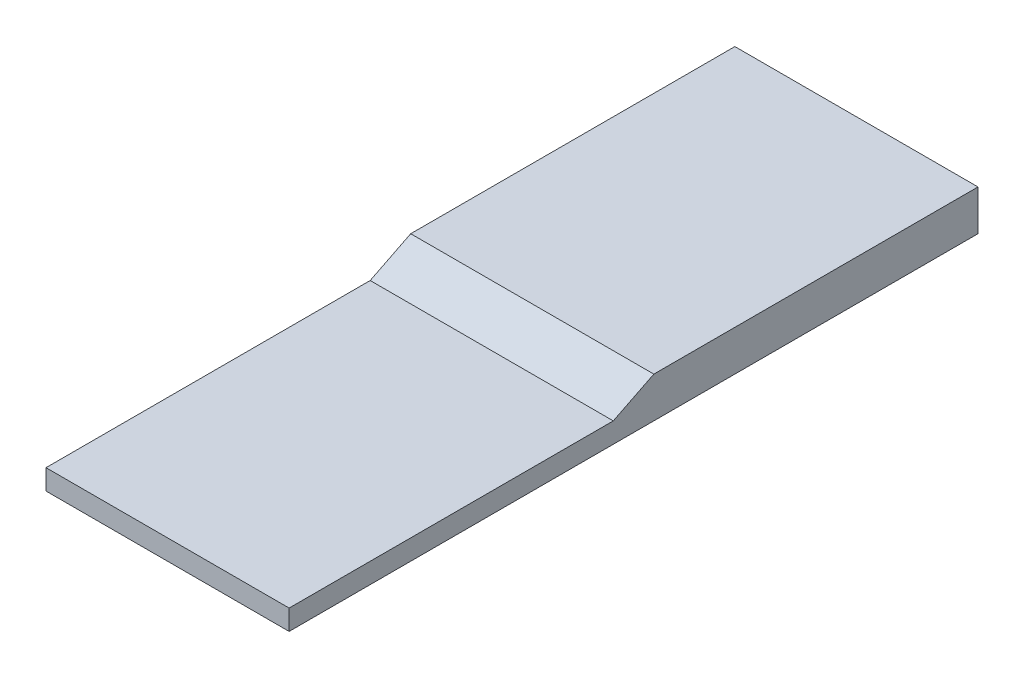
ISO-10303-21;
HEADER;
FILE_DESCRIPTION(('STEP AP214'),'2;1');
FILE_NAME('part.step','',(''),(''),'','','');
FILE_SCHEMA(('AUTOMOTIVE_DESIGN { 1 0 10303 214 1 1 1 1 }'));
ENDSEC;
DATA;
#1=APPLICATION_CONTEXT('core data for automotive mechanical design processes');
#2=APPLICATION_PROTOCOL_DEFINITION('international standard','automotive_design',2000,#1);
#3=PRODUCT_CONTEXT('',#1,'mechanical');
#4=PRODUCT('Part','Part','',(#3));
#5=PRODUCT_RELATED_PRODUCT_CATEGORY('part','',(#4));
#6=PRODUCT_DEFINITION_FORMATION('','',#4);
#7=PRODUCT_DEFINITION_CONTEXT('part definition',#1,'design');
#8=PRODUCT_DEFINITION('design','',#6,#7);
#9=PRODUCT_DEFINITION_SHAPE('','',#8);
#10=(LENGTH_UNIT() NAMED_UNIT(*) SI_UNIT(.MILLI.,.METRE.));
#11=(NAMED_UNIT(*) PLANE_ANGLE_UNIT() SI_UNIT($,.RADIAN.));
#12=(NAMED_UNIT(*) SI_UNIT($,.STERADIAN.) SOLID_ANGLE_UNIT());
#13=UNCERTAINTY_MEASURE_WITH_UNIT(LENGTH_MEASURE(1.E-05),#10,'distance_accuracy_value','');
#14=(GEOMETRIC_REPRESENTATION_CONTEXT(3) GLOBAL_UNCERTAINTY_ASSIGNED_CONTEXT((#13)) GLOBAL_UNIT_ASSIGNED_CONTEXT((#10,
#11,#12)) REPRESENTATION_CONTEXT('',''));
#15=CARTESIAN_POINT('',(0.,0.,0.));
#16=DIRECTION('',(0.,0.,1.));
#17=DIRECTION('',(1.,0.,0.));
#18=AXIS2_PLACEMENT_3D('',#15,#16,#17);
#19=CARTESIAN_POINT('',(304.8,-25.4,406.4));
#20=DIRECTION('',(0.,0.,-1.));
#21=DIRECTION('',(-1.,0.,0.));
#22=AXIS2_PLACEMENT_3D('',#19,#20,#21);
#23=PLANE('',#22);
#24=DIRECTION('',(0.,-1.,0.));
#25=VECTOR('',#24,1.);
#26=CARTESIAN_POINT('',(0.,-25.4,406.4));
#27=LINE('',#26,#25);
#28=CARTESIAN_POINT('',(0.,0.,406.4));
#29=VERTEX_POINT('',#28);
#30=CARTESIAN_POINT('',(0.,-25.4,406.4));
#31=VERTEX_POINT('',#30);
#32=EDGE_CURVE('E117',#29,#31,#27,.T.);
#33=ORIENTED_EDGE('',*,*,#32,.T.);
#34=DIRECTION('',(-1.,0.,0.));
#35=VECTOR('',#34,1.);
#36=CARTESIAN_POINT('',(304.8,-25.4,406.4));
#37=LINE('',#36,#35);
#38=CARTESIAN_POINT('',(304.8,-25.4,406.4));
#39=VERTEX_POINT('',#38);
#40=EDGE_CURVE('E11',#39,#31,#37,.T.);
#41=ORIENTED_EDGE('',*,*,#40,.F.);
#42=DIRECTION('',(0.,-1.,0.));
#43=VECTOR('',#42,1.);
#44=CARTESIAN_POINT('',(304.8,-25.4,406.4));
#45=LINE('',#44,#43);
#46=CARTESIAN_POINT('',(304.8,0.,406.4));
#47=VERTEX_POINT('',#46);
#48=EDGE_CURVE('E127',#47,#39,#45,.T.);
#49=ORIENTED_EDGE('',*,*,#48,.F.);
#50=DIRECTION('',(-1.,0.,0.));
#51=VECTOR('',#50,1.);
#52=CARTESIAN_POINT('',(304.8,0.,406.4));
#53=LINE('',#52,#51);
#54=EDGE_CURVE('E113',#47,#29,#53,.T.);
#55=ORIENTED_EDGE('',*,*,#54,.T.);
#56=EDGE_LOOP('',(#33,#41,#49,#55));
#57=FACE_BOUND('',#56,.T.);
#58=ADVANCED_FACE('F33',(#57),#23,.F.);
#59=CARTESIAN_POINT('',(304.8,-25.3999999999999,-457.2));
#60=DIRECTION('',(0.,1.,0.));
#61=DIRECTION('',(0.,0.,1.));
#62=AXIS2_PLACEMENT_3D('',#59,#60,#61);
#63=PLANE('',#62);
#64=DIRECTION('',(0.,0.,-1.));
#65=VECTOR('',#64,1.);
#66=CARTESIAN_POINT('',(0.,-25.3999999999999,-457.2));
#67=LINE('',#66,#65);
#68=CARTESIAN_POINT('',(0.,-25.3999999999999,-457.2));
#69=VERTEX_POINT('',#68);
#70=EDGE_CURVE('E120',#31,#69,#67,.T.);
#71=ORIENTED_EDGE('',*,*,#70,.T.);
#72=DIRECTION('',(-1.,0.,0.));
#73=VECTOR('',#72,1.);
#74=CARTESIAN_POINT('',(304.8,-25.3999999999999,-457.2));
#75=LINE('',#74,#73);
#76=CARTESIAN_POINT('',(304.8,-25.3999999999999,-457.2));
#77=VERTEX_POINT('',#76);
#78=EDGE_CURVE('E41',#77,#69,#75,.T.);
#79=ORIENTED_EDGE('',*,*,#78,.F.);
#80=DIRECTION('',(0.,0.,-1.));
#81=VECTOR('',#80,1.);
#82=CARTESIAN_POINT('',(304.8,-25.3999999999999,-457.2));
#83=LINE('',#82,#81);
#84=EDGE_CURVE('E86',#39,#77,#83,.T.);
#85=ORIENTED_EDGE('',*,*,#84,.F.);
#86=ORIENTED_EDGE('',*,*,#40,.T.);
#87=EDGE_LOOP('',(#71,#79,#85,#86));
#88=FACE_BOUND('',#87,.T.);
#89=ADVANCED_FACE('F151',(#88),#63,.F.);
#90=CARTESIAN_POINT('',(304.8,25.4,-457.2));
#91=DIRECTION('',(0.,0.,1.));
#92=DIRECTION('',(1.,0.,0.));
#93=AXIS2_PLACEMENT_3D('',#90,#91,#92);
#94=PLANE('',#93);
#95=DIRECTION('',(0.,1.,0.));
#96=VECTOR('',#95,1.);
#97=CARTESIAN_POINT('',(0.,25.4,-457.2));
#98=LINE('',#97,#96);
#99=CARTESIAN_POINT('',(0.,25.4,-457.2));
#100=VERTEX_POINT('',#99);
#101=EDGE_CURVE('E122',#69,#100,#98,.T.);
#102=ORIENTED_EDGE('',*,*,#101,.T.);
#103=DIRECTION('',(-1.,0.,0.));
#104=VECTOR('',#103,1.);
#105=CARTESIAN_POINT('',(304.8,25.4,-457.2));
#106=LINE('',#105,#104);
#107=CARTESIAN_POINT('',(304.8,25.4,-457.2));
#108=VERTEX_POINT('',#107);
#109=EDGE_CURVE('E108',#108,#100,#106,.T.);
#110=ORIENTED_EDGE('',*,*,#109,.F.);
#111=DIRECTION('',(0.,1.,0.));
#112=VECTOR('',#111,1.);
#113=CARTESIAN_POINT('',(304.8,25.4,-457.2));
#114=LINE('',#113,#112);
#115=EDGE_CURVE('E99',#77,#108,#114,.T.);
#116=ORIENTED_EDGE('',*,*,#115,.F.);
#117=ORIENTED_EDGE('',*,*,#78,.T.);
#118=EDGE_LOOP('',(#102,#110,#116,#117));
#119=FACE_BOUND('',#118,.T.);
#120=ADVANCED_FACE('F133',(#119),#94,.F.);
#121=CARTESIAN_POINT('',(304.8,25.4,-50.8));
#122=DIRECTION('',(0.,-1.,0.));
#123=DIRECTION('',(0.,0.,-1.));
#124=AXIS2_PLACEMENT_3D('',#121,#122,#123);
#125=PLANE('',#124);
#126=DIRECTION('',(0.,0.,1.));
#127=VECTOR('',#126,1.);
#128=CARTESIAN_POINT('',(0.,25.4,-50.8));
#129=LINE('',#128,#127);
#130=CARTESIAN_POINT('',(0.,25.4,-50.8));
#131=VERTEX_POINT('',#130);
#132=EDGE_CURVE('E107',#100,#131,#129,.T.);
#133=ORIENTED_EDGE('',*,*,#132,.T.);
#134=DIRECTION('',(-1.,0.,0.));
#135=VECTOR('',#134,1.);
#136=CARTESIAN_POINT('',(304.8,25.4,-50.8));
#137=LINE('',#136,#135);
#138=CARTESIAN_POINT('',(304.8,25.4,-50.8));
#139=VERTEX_POINT('',#138);
#140=EDGE_CURVE('E104',#139,#131,#137,.T.);
#141=ORIENTED_EDGE('',*,*,#140,.F.);
#142=DIRECTION('',(0.,0.,1.));
#143=VECTOR('',#142,1.);
#144=CARTESIAN_POINT('',(304.8,25.4,-50.8));
#145=LINE('',#144,#143);
#146=EDGE_CURVE('E93',#108,#139,#145,.T.);
#147=ORIENTED_EDGE('',*,*,#146,.F.);
#148=ORIENTED_EDGE('',*,*,#109,.T.);
#149=EDGE_LOOP('',(#133,#141,#147,#148));
#150=FACE_BOUND('',#149,.T.);
#151=ADVANCED_FACE('F105',(#150),#125,.F.);
#152=CARTESIAN_POINT('',(304.8,0.,0.));
#153=DIRECTION('',(0.,-0.894427190999916,-0.447213595499958));
#154=DIRECTION('',(0.,0.447213595499958,-0.894427190999916));
#155=AXIS2_PLACEMENT_3D('',#152,#153,#154);
#156=PLANE('',#155);
#157=DIRECTION('',(0.,-0.447213595499958,0.894427190999916));
#158=VECTOR('',#157,1.);
#159=CARTESIAN_POINT('',(0.,0.,0.));
#160=LINE('',#159,#158);
#161=CARTESIAN_POINT('',(0.,0.,0.));
#162=VERTEX_POINT('',#161);
#163=EDGE_CURVE('E72',#131,#162,#160,.T.);
#164=ORIENTED_EDGE('',*,*,#163,.T.);
#165=DIRECTION('',(-1.,0.,0.));
#166=VECTOR('',#165,1.);
#167=CARTESIAN_POINT('',(304.8,0.,0.));
#168=LINE('',#167,#166);
#169=CARTESIAN_POINT('',(304.8,0.,0.));
#170=VERTEX_POINT('',#169);
#171=EDGE_CURVE('E109',#170,#162,#168,.T.);
#172=ORIENTED_EDGE('',*,*,#171,.F.);
#173=DIRECTION('',(0.,-0.447213595499958,0.894427190999916));
#174=VECTOR('',#173,1.);
#175=CARTESIAN_POINT('',(304.8,0.,0.));
#176=LINE('',#175,#174);
#177=EDGE_CURVE('E97',#139,#170,#176,.T.);
#178=ORIENTED_EDGE('',*,*,#177,.F.);
#179=ORIENTED_EDGE('',*,*,#140,.T.);
#180=EDGE_LOOP('',(#164,#172,#178,#179));
#181=FACE_BOUND('',#180,.T.);
#182=ADVANCED_FACE('F111',(#181),#156,.F.);
#183=CARTESIAN_POINT('',(304.8,0.,406.4));
#184=DIRECTION('',(0.,-1.,0.));
#185=DIRECTION('',(0.,0.,-1.));
#186=AXIS2_PLACEMENT_3D('',#183,#184,#185);
#187=PLANE('',#186);
#188=DIRECTION('',(0.,0.,1.));
#189=VECTOR('',#188,1.);
#190=CARTESIAN_POINT('',(0.,0.,406.4));
#191=LINE('',#190,#189);
#192=EDGE_CURVE('E78',#162,#29,#191,.T.);
#193=ORIENTED_EDGE('',*,*,#192,.T.);
#194=ORIENTED_EDGE('',*,*,#54,.F.);
#195=DIRECTION('',(0.,0.,1.));
#196=VECTOR('',#195,1.);
#197=CARTESIAN_POINT('',(304.8,0.,406.4));
#198=LINE('',#197,#196);
#199=EDGE_CURVE('E49',#170,#47,#198,.T.);
#200=ORIENTED_EDGE('',*,*,#199,.F.);
#201=ORIENTED_EDGE('',*,*,#171,.T.);
#202=EDGE_LOOP('',(#193,#194,#200,#201));
#203=FACE_BOUND('',#202,.T.);
#204=ADVANCED_FACE('F140',(#203),#187,.F.);
#205=CARTESIAN_POINT('',(304.8,0.,0.));
#206=DIRECTION('',(-1.,0.,0.));
#207=DIRECTION('',(0.,0.,1.));
#208=AXIS2_PLACEMENT_3D('',#205,#206,#207);
#209=PLANE('',#208);
#210=ORIENTED_EDGE('',*,*,#48,.T.);
#211=ORIENTED_EDGE('',*,*,#84,.T.);
#212=ORIENTED_EDGE('',*,*,#115,.T.);
#213=ORIENTED_EDGE('',*,*,#146,.T.);
#214=ORIENTED_EDGE('',*,*,#177,.T.);
#215=ORIENTED_EDGE('',*,*,#199,.T.);
#216=EDGE_LOOP('',(#210,#211,#212,#213,#214,#215));
#217=FACE_BOUND('',#216,.T.);
#218=ADVANCED_FACE('F95',(#217),#209,.F.);
#219=CARTESIAN_POINT('',(0.,0.,0.));
#220=DIRECTION('',(-1.,0.,0.));
#221=DIRECTION('',(0.,0.,1.));
#222=AXIS2_PLACEMENT_3D('',#219,#220,#221);
#223=PLANE('',#222);
#224=ORIENTED_EDGE('',*,*,#32,.F.);
#225=ORIENTED_EDGE('',*,*,#192,.F.);
#226=ORIENTED_EDGE('',*,*,#163,.F.);
#227=ORIENTED_EDGE('',*,*,#132,.F.);
#228=ORIENTED_EDGE('',*,*,#101,.F.);
#229=ORIENTED_EDGE('',*,*,#70,.F.);
#230=EDGE_LOOP('',(#224,#225,#226,#227,#228,#229));
#231=FACE_BOUND('',#230,.T.);
#232=ADVANCED_FACE('F136',(#231),#223,.T.);
#233=CLOSED_SHELL('',(#58,#89,#120,#151,#182,#204,#218,#232));
#234=MANIFOLD_SOLID_BREP('B2',#233);
#235=ADVANCED_BREP_SHAPE_REPRESENTATION('',(#18,#234),#14);
#236=SHAPE_DEFINITION_REPRESENTATION(#9,#235);
ENDSEC;
END-ISO-10303-21;
